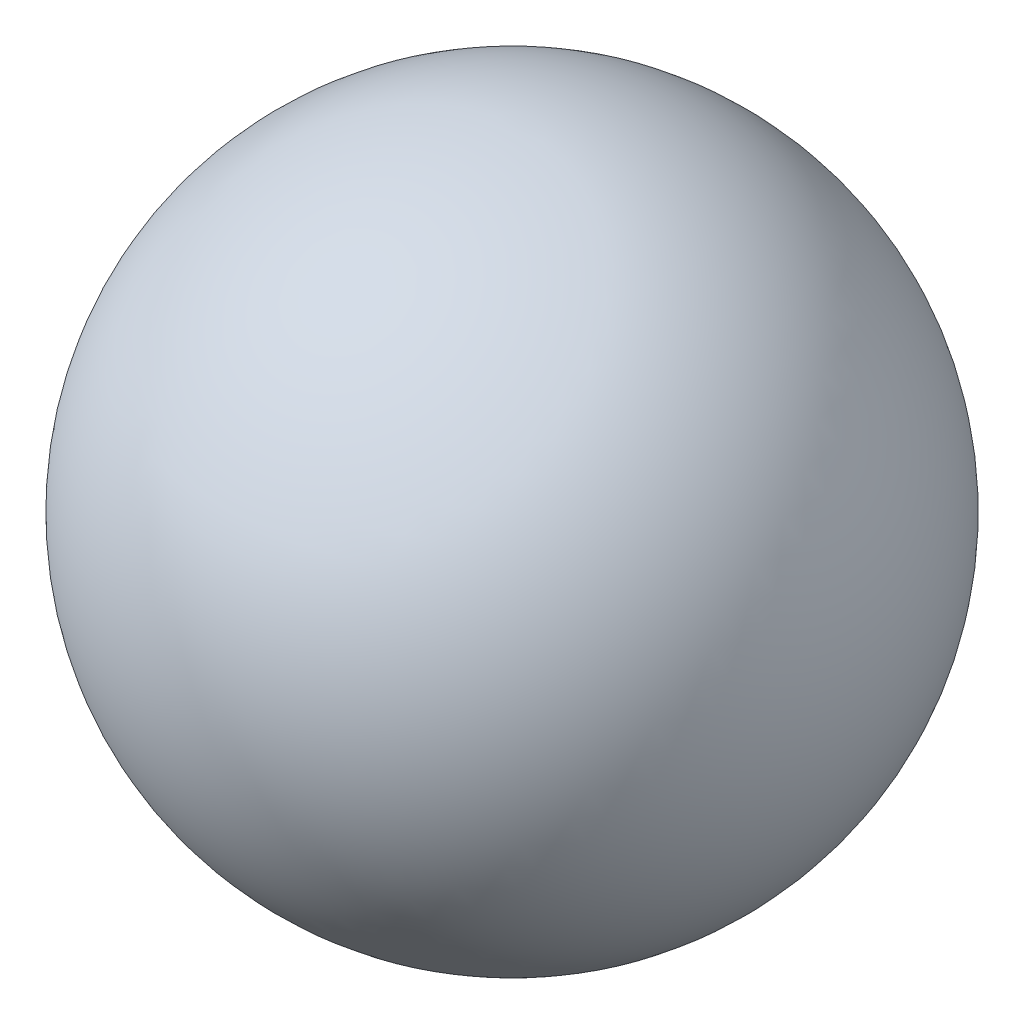
ISO-10303-21;
HEADER;
FILE_DESCRIPTION(('STEP AP214'),'2;1');
FILE_NAME('part.step','',(''),(''),'','','');
FILE_SCHEMA(('AUTOMOTIVE_DESIGN { 1 0 10303 214 1 1 1 1 }'));
ENDSEC;
DATA;
#1=APPLICATION_CONTEXT('core data for automotive mechanical design processes');
#2=APPLICATION_PROTOCOL_DEFINITION('international standard','automotive_design',2000,#1);
#3=PRODUCT_CONTEXT('',#1,'mechanical');
#4=PRODUCT('Part','Part','',(#3));
#5=PRODUCT_RELATED_PRODUCT_CATEGORY('part','',(#4));
#6=PRODUCT_DEFINITION_FORMATION('','',#4);
#7=PRODUCT_DEFINITION_CONTEXT('part definition',#1,'design');
#8=PRODUCT_DEFINITION('design','',#6,#7);
#9=PRODUCT_DEFINITION_SHAPE('','',#8);
#10=(LENGTH_UNIT() NAMED_UNIT(*) SI_UNIT(.MILLI.,.METRE.));
#11=(NAMED_UNIT(*) PLANE_ANGLE_UNIT() SI_UNIT($,.RADIAN.));
#12=(NAMED_UNIT(*) SI_UNIT($,.STERADIAN.) SOLID_ANGLE_UNIT());
#13=UNCERTAINTY_MEASURE_WITH_UNIT(LENGTH_MEASURE(1.E-05),#10,'distance_accuracy_value','');
#14=(GEOMETRIC_REPRESENTATION_CONTEXT(3) GLOBAL_UNCERTAINTY_ASSIGNED_CONTEXT((#13)) GLOBAL_UNIT_ASSIGNED_CONTEXT((#10,
#11,#12)) REPRESENTATION_CONTEXT('',''));
#15=CARTESIAN_POINT('',(0.,0.,0.));
#16=DIRECTION('',(0.,0.,1.));
#17=DIRECTION('',(1.,0.,0.));
#18=AXIS2_PLACEMENT_3D('',#15,#16,#17);
#19=CARTESIAN_POINT('',(0.,0.,0.));
#20=DIRECTION('',(0.,1.,0.));
#21=DIRECTION('',(1.,0.,0.));
#22=AXIS2_PLACEMENT_3D('',#19,#20,#21);
#23=SPHERICAL_SURFACE('',#22,4.7625);
#24=CARTESIAN_POINT('',(0.,4.7625,0.));
#25=VERTEX_POINT('',#24);
#26=VERTEX_LOOP('',#25);
#27=FACE_BOUND('',#26,.T.);
#28=ADVANCED_FACE('F29',(#27),#23,.T.);
#29=CLOSED_SHELL('',(#28));
#30=MANIFOLD_SOLID_BREP('B2',#29);
#31=ADVANCED_BREP_SHAPE_REPRESENTATION('',(#18,#30),#14);
#32=SHAPE_DEFINITION_REPRESENTATION(#9,#31);
ENDSEC;
END-ISO-10303-21;
